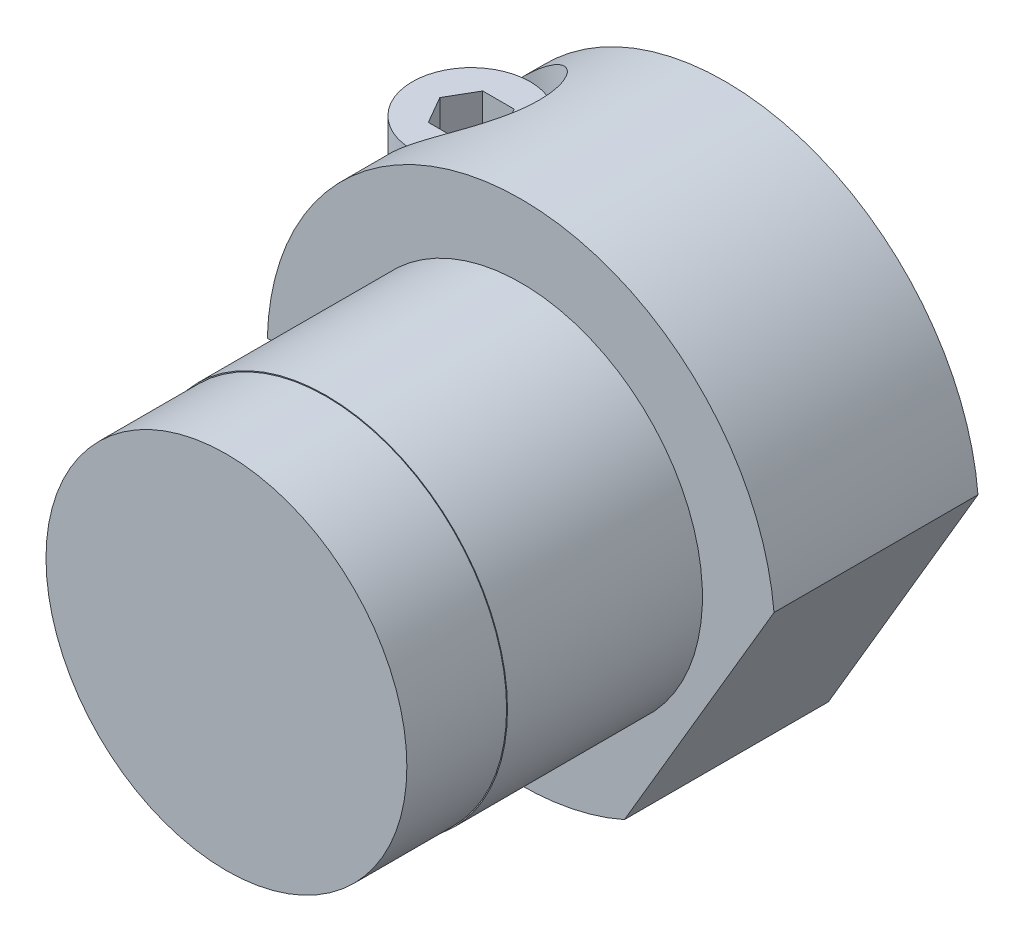
ISO-10303-21;
HEADER;
FILE_DESCRIPTION(('STEP AP214'),'2;1');
FILE_NAME('part.step','',(''),(''),'','','');
FILE_SCHEMA(('AUTOMOTIVE_DESIGN { 1 0 10303 214 1 1 1 1 }'));
ENDSEC;
DATA;
#1=APPLICATION_CONTEXT('core data for automotive mechanical design processes');
#2=APPLICATION_PROTOCOL_DEFINITION('international standard','automotive_design',2000,#1);
#3=PRODUCT_CONTEXT('',#1,'mechanical');
#4=PRODUCT('Part','Part','',(#3));
#5=PRODUCT_RELATED_PRODUCT_CATEGORY('part','',(#4));
#6=PRODUCT_DEFINITION_FORMATION('','',#4);
#7=PRODUCT_DEFINITION_CONTEXT('part definition',#1,'design');
#8=PRODUCT_DEFINITION('design','',#6,#7);
#9=PRODUCT_DEFINITION_SHAPE('','',#8);
#10=(LENGTH_UNIT() NAMED_UNIT(*) SI_UNIT(.MILLI.,.METRE.));
#11=(NAMED_UNIT(*) PLANE_ANGLE_UNIT() SI_UNIT($,.RADIAN.));
#12=(NAMED_UNIT(*) SI_UNIT($,.STERADIAN.) SOLID_ANGLE_UNIT());
#13=UNCERTAINTY_MEASURE_WITH_UNIT(LENGTH_MEASURE(1.E-05),#10,'distance_accuracy_value','');
#14=(GEOMETRIC_REPRESENTATION_CONTEXT(3) GLOBAL_UNCERTAINTY_ASSIGNED_CONTEXT((#13)) GLOBAL_UNIT_ASSIGNED_CONTEXT((#10,
#11,#12)) REPRESENTATION_CONTEXT('',''));
#15=CARTESIAN_POINT('',(0.,0.,0.));
#16=DIRECTION('',(0.,0.,1.));
#17=DIRECTION('',(1.,0.,0.));
#18=AXIS2_PLACEMENT_3D('',#15,#16,#17);
#19=CARTESIAN_POINT('',(-18.,10.7117113166242,10.));
#20=DIRECTION('',(0.,-1.,0.));
#21=DIRECTION('',(0.,0.,-1.));
#22=AXIS2_PLACEMENT_3D('',#19,#20,#21);
#23=PLANE('',#22);
#24=DIRECTION('',(-0.5,0.,0.866025403784439));
#25=VECTOR('',#24,1.);
#26=CARTESIAN_POINT('',(-16.2679491924311,10.7117113166242,13.));
#27=LINE('',#26,#25);
#28=CARTESIAN_POINT('',(-14.5358983848622,10.7117113166242,10.));
#29=VERTEX_POINT('',#28);
#30=CARTESIAN_POINT('',(-16.2679491924311,10.7117113166242,13.));
#31=VERTEX_POINT('',#30);
#32=EDGE_CURVE('E181',#29,#31,#27,.T.);
#33=ORIENTED_EDGE('',*,*,#32,.F.);
#34=DIRECTION('',(0.5,0.,0.866025403784438));
#35=VECTOR('',#34,1.);
#36=CARTESIAN_POINT('',(-14.5358983848622,10.7117113166242,10.));
#37=LINE('',#36,#35);
#38=CARTESIAN_POINT('',(-16.2679491924311,10.7117113166242,7.));
#39=VERTEX_POINT('',#38);
#40=EDGE_CURVE('E184',#39,#29,#37,.T.);
#41=ORIENTED_EDGE('',*,*,#40,.F.);
#42=DIRECTION('',(1.,0.,0.));
#43=VECTOR('',#42,1.);
#44=CARTESIAN_POINT('',(-16.2679491924311,10.7117113166242,7.));
#45=LINE('',#44,#43);
#46=CARTESIAN_POINT('',(-19.7320508075689,10.7117113166242,7.));
#47=VERTEX_POINT('',#46);
#48=EDGE_CURVE('E157',#47,#39,#45,.T.);
#49=ORIENTED_EDGE('',*,*,#48,.F.);
#50=DIRECTION('',(0.500000000000001,0.,-0.866025403784438));
#51=VECTOR('',#50,1.);
#52=CARTESIAN_POINT('',(-19.7320508075689,10.7117113166242,7.));
#53=LINE('',#52,#51);
#54=CARTESIAN_POINT('',(-21.4641016151378,10.7117113166242,10.));
#55=VERTEX_POINT('',#54);
#56=EDGE_CURVE('E163',#55,#47,#53,.T.);
#57=ORIENTED_EDGE('',*,*,#56,.F.);
#58=DIRECTION('',(-0.500000000000001,0.,-0.866025403784438));
#59=VECTOR('',#58,1.);
#60=CARTESIAN_POINT('',(-21.4641016151378,10.7117113166242,10.));
#61=LINE('',#60,#59);
#62=CARTESIAN_POINT('',(-19.7320508075689,10.7117113166242,13.));
#63=VERTEX_POINT('',#62);
#64=EDGE_CURVE('E169',#63,#55,#61,.T.);
#65=ORIENTED_EDGE('',*,*,#64,.F.);
#66=DIRECTION('',(-1.,0.,0.));
#67=VECTOR('',#66,1.);
#68=CARTESIAN_POINT('',(-19.7320508075689,10.7117113166242,13.));
#69=LINE('',#68,#67);
#70=EDGE_CURVE('E175',#31,#63,#69,.T.);
#71=ORIENTED_EDGE('',*,*,#70,.F.);
#72=EDGE_LOOP('',(#33,#41,#49,#57,#65,#71));
#73=FACE_BOUND('',#72,.T.);
#74=ADVANCED_FACE('F17',(#73),#23,.F.);
#75=CARTESIAN_POINT('',(0.,0.,55.));
#76=DIRECTION('',(0.,0.,1.));
#77=DIRECTION('',(1.,0.,0.));
#78=AXIS2_PLACEMENT_3D('',#75,#76,#77);
#79=PLANE('',#78);
#80=CARTESIAN_POINT('',(0.,0.,55.));
#81=DIRECTION('',(0.,0.,-1.));
#82=DIRECTION('',(-1.,0.,0.));
#83=AXIS2_PLACEMENT_3D('',#80,#81,#82);
#84=CIRCLE('',#83,19.9);
#85=CARTESIAN_POINT('',(-19.9,0.,55.));
#86=VERTEX_POINT('',#85);
#87=EDGE_CURVE('E20',#86,#86,#84,.T.);
#88=ORIENTED_EDGE('',*,*,#87,.F.);
#89=EDGE_LOOP('',(#88));
#90=FACE_BOUND('',#89,.T.);
#91=ADVANCED_FACE('F330',(#90),#79,.T.);
#92=CARTESIAN_POINT('',(-14.5358983848622,20.7117113166242,10.));
#93=DIRECTION('',(-0.866025403784438,0.,0.5));
#94=DIRECTION('',(0.5,0.,0.866025403784438));
#95=AXIS2_PLACEMENT_3D('',#92,#93,#94);
#96=PLANE('',#95);
#97=DIRECTION('',(0.500000000000001,0.,0.866025403784438));
#98=VECTOR('',#97,1.);
#99=CARTESIAN_POINT('',(-16.2679491924311,20.7117113166242,7.));
#100=LINE('',#99,#98);
#101=CARTESIAN_POINT('',(-16.2679491924311,20.7117113166242,7.));
#102=VERTEX_POINT('',#101);
#103=CARTESIAN_POINT('',(-14.5358983848622,20.7117113166242,10.));
#104=VERTEX_POINT('',#103);
#105=EDGE_CURVE('E148',#102,#104,#100,.T.);
#106=ORIENTED_EDGE('',*,*,#105,.F.);
#107=DIRECTION('',(0.,1.,0.));
#108=VECTOR('',#107,1.);
#109=CARTESIAN_POINT('',(-16.2679491924311,20.7117113166242,7.));
#110=LINE('',#109,#108);
#111=EDGE_CURVE('E154',#39,#102,#110,.T.);
#112=ORIENTED_EDGE('',*,*,#111,.F.);
#113=ORIENTED_EDGE('',*,*,#40,.T.);
#114=DIRECTION('',(0.,1.,0.));
#115=VECTOR('',#114,1.);
#116=CARTESIAN_POINT('',(-14.5358983848622,20.7117113166242,10.));
#117=LINE('',#116,#115);
#118=EDGE_CURVE('E178',#104,#29,#117,.F.);
#119=ORIENTED_EDGE('',*,*,#118,.F.);
#120=EDGE_LOOP('',(#106,#112,#113,#119));
#121=FACE_BOUND('',#120,.T.);
#122=ADVANCED_FACE('F332',(#121),#96,.T.);
#123=CARTESIAN_POINT('',(-16.2679491924311,20.7117113166242,13.));
#124=DIRECTION('',(-0.866025403784439,0.,-0.5));
#125=DIRECTION('',(-0.5,0.,0.866025403784439));
#126=AXIS2_PLACEMENT_3D('',#123,#124,#125);
#127=PLANE('',#126);
#128=DIRECTION('',(-0.500000000000001,0.,0.866025403784438));
#129=VECTOR('',#128,1.);
#130=CARTESIAN_POINT('',(-14.5358983848622,20.7117113166242,10.));
#131=LINE('',#130,#129);
#132=CARTESIAN_POINT('',(-16.2679491924311,20.7117113166242,13.));
#133=VERTEX_POINT('',#132);
#134=EDGE_CURVE('E145',#104,#133,#131,.T.);
#135=ORIENTED_EDGE('',*,*,#134,.F.);
#136=ORIENTED_EDGE('',*,*,#118,.T.);
#137=ORIENTED_EDGE('',*,*,#32,.T.);
#138=DIRECTION('',(0.,1.,0.));
#139=VECTOR('',#138,1.);
#140=CARTESIAN_POINT('',(-16.2679491924311,20.7117113166242,13.));
#141=LINE('',#140,#139);
#142=EDGE_CURVE('E172',#133,#31,#141,.F.);
#143=ORIENTED_EDGE('',*,*,#142,.F.);
#144=EDGE_LOOP('',(#135,#136,#137,#143));
#145=FACE_BOUND('',#144,.T.);
#146=ADVANCED_FACE('F337',(#145),#127,.T.);
#147=CARTESIAN_POINT('',(-19.7320508075689,20.7117113166242,13.));
#148=DIRECTION('',(0.,0.,-1.));
#149=DIRECTION('',(-1.,0.,0.));
#150=AXIS2_PLACEMENT_3D('',#147,#148,#149);
#151=PLANE('',#150);
#152=DIRECTION('',(1.,0.,0.));
#153=VECTOR('',#152,1.);
#154=CARTESIAN_POINT('',(-18.,20.7117113166242,13.));
#155=LINE('',#154,#153);
#156=CARTESIAN_POINT('',(-19.7320508075689,20.7117113166242,13.));
#157=VERTEX_POINT('',#156);
#158=EDGE_CURVE('E142',#133,#157,#155,.F.);
#159=ORIENTED_EDGE('',*,*,#158,.F.);
#160=ORIENTED_EDGE('',*,*,#142,.T.);
#161=ORIENTED_EDGE('',*,*,#70,.T.);
#162=DIRECTION('',(0.,1.,0.));
#163=VECTOR('',#162,1.);
#164=CARTESIAN_POINT('',(-19.7320508075689,20.7117113166242,13.));
#165=LINE('',#164,#163);
#166=EDGE_CURVE('E166',#157,#63,#165,.F.);
#167=ORIENTED_EDGE('',*,*,#166,.F.);
#168=EDGE_LOOP('',(#159,#160,#161,#167));
#169=FACE_BOUND('',#168,.T.);
#170=ADVANCED_FACE('F344',(#169),#151,.T.);
#171=CARTESIAN_POINT('',(-21.4641016151378,20.7117113166242,10.));
#172=DIRECTION('',(0.866025403784438,0.,-0.500000000000001));
#173=DIRECTION('',(-0.500000000000001,0.,-0.866025403784438));
#174=AXIS2_PLACEMENT_3D('',#171,#172,#173);
#175=PLANE('',#174);
#176=DIRECTION('',(-0.5,0.,-0.866025403784438));
#177=VECTOR('',#176,1.);
#178=CARTESIAN_POINT('',(-19.7320508075689,20.7117113166242,13.));
#179=LINE('',#178,#177);
#180=CARTESIAN_POINT('',(-21.4641016151378,20.7117113166242,10.));
#181=VERTEX_POINT('',#180);
#182=EDGE_CURVE('E139',#157,#181,#179,.T.);
#183=ORIENTED_EDGE('',*,*,#182,.F.);
#184=ORIENTED_EDGE('',*,*,#166,.T.);
#185=ORIENTED_EDGE('',*,*,#64,.T.);
#186=DIRECTION('',(0.,1.,0.));
#187=VECTOR('',#186,1.);
#188=CARTESIAN_POINT('',(-21.4641016151378,20.7117113166242,10.));
#189=LINE('',#188,#187);
#190=EDGE_CURVE('E160',#181,#55,#189,.F.);
#191=ORIENTED_EDGE('',*,*,#190,.F.);
#192=EDGE_LOOP('',(#183,#184,#185,#191));
#193=FACE_BOUND('',#192,.T.);
#194=ADVANCED_FACE('F348',(#193),#175,.T.);
#195=CARTESIAN_POINT('',(-19.7320508075689,20.7117113166242,7.));
#196=DIRECTION('',(0.866025403784438,0.,0.500000000000001));
#197=DIRECTION('',(0.500000000000001,0.,-0.866025403784438));
#198=AXIS2_PLACEMENT_3D('',#195,#196,#197);
#199=PLANE('',#198);
#200=DIRECTION('',(0.500000000000001,0.,-0.866025403784438));
#201=VECTOR('',#200,1.);
#202=CARTESIAN_POINT('',(-21.4641016151378,20.7117113166242,10.));
#203=LINE('',#202,#201);
#204=CARTESIAN_POINT('',(-19.7320508075689,20.7117113166242,7.));
#205=VERTEX_POINT('',#204);
#206=EDGE_CURVE('E136',#181,#205,#203,.T.);
#207=ORIENTED_EDGE('',*,*,#206,.F.);
#208=ORIENTED_EDGE('',*,*,#190,.T.);
#209=ORIENTED_EDGE('',*,*,#56,.T.);
#210=DIRECTION('',(0.,1.,0.));
#211=VECTOR('',#210,1.);
#212=CARTESIAN_POINT('',(-19.7320508075689,20.7117113166242,7.));
#213=LINE('',#212,#211);
#214=EDGE_CURVE('E151',#205,#47,#213,.F.);
#215=ORIENTED_EDGE('',*,*,#214,.F.);
#216=EDGE_LOOP('',(#207,#208,#209,#215));
#217=FACE_BOUND('',#216,.T.);
#218=ADVANCED_FACE('F352',(#217),#199,.T.);
#219=CARTESIAN_POINT('',(-16.2679491924311,20.7117113166242,7.));
#220=DIRECTION('',(0.,0.,1.));
#221=DIRECTION('',(1.,0.,0.));
#222=AXIS2_PLACEMENT_3D('',#219,#220,#221);
#223=PLANE('',#222);
#224=DIRECTION('',(1.,0.,0.));
#225=VECTOR('',#224,1.);
#226=CARTESIAN_POINT('',(-18.,20.7117113166242,7.));
#227=LINE('',#226,#225);
#228=EDGE_CURVE('E132',#205,#102,#227,.T.);
#229=ORIENTED_EDGE('',*,*,#228,.F.);
#230=ORIENTED_EDGE('',*,*,#214,.T.);
#231=ORIENTED_EDGE('',*,*,#48,.T.);
#232=ORIENTED_EDGE('',*,*,#111,.T.);
#233=EDGE_LOOP('',(#229,#230,#231,#232));
#234=FACE_BOUND('',#233,.T.);
#235=ADVANCED_FACE('F325',(#234),#223,.T.);
#236=CARTESIAN_POINT('',(0.,0.,55.));
#237=DIRECTION('',(0.,0.,-1.));
#238=DIRECTION('',(-1.,0.,0.));
#239=AXIS2_PLACEMENT_3D('',#236,#237,#238);
#240=CYLINDRICAL_SURFACE('',#239,19.9);
#241=CARTESIAN_POINT('',(0.,0.,44.));
#242=DIRECTION('',(0.,0.,-1.));
#243=DIRECTION('',(-1.,0.,0.));
#244=AXIS2_PLACEMENT_3D('',#241,#242,#243);
#245=CIRCLE('',#244,19.9);
#246=CARTESIAN_POINT('',(-19.9,0.,44.));
#247=VERTEX_POINT('',#246);
#248=EDGE_CURVE('E135',#247,#247,#245,.T.);
#249=ORIENTED_EDGE('',*,*,#248,.F.);
#250=EDGE_LOOP('',(#249));
#251=FACE_BOUND('',#250,.T.);
#252=ORIENTED_EDGE('',*,*,#87,.T.);
#253=EDGE_LOOP('',(#252));
#254=FACE_BOUND('',#253,.T.);
#255=ADVANCED_FACE('F321',(#251,#254),#240,.T.);
#256=CARTESIAN_POINT('',(-18.,20.7117113166242,10.));
#257=DIRECTION('',(0.,1.,0.));
#258=DIRECTION('',(0.,0.,1.));
#259=AXIS2_PLACEMENT_3D('',#256,#257,#258);
#260=PLANE('',#259);
#261=ORIENTED_EDGE('',*,*,#206,.T.);
#262=ORIENTED_EDGE('',*,*,#228,.T.);
#263=ORIENTED_EDGE('',*,*,#105,.T.);
#264=ORIENTED_EDGE('',*,*,#134,.T.);
#265=ORIENTED_EDGE('',*,*,#158,.T.);
#266=ORIENTED_EDGE('',*,*,#182,.T.);
#267=EDGE_LOOP('',(#261,#262,#263,#264,#265,#266));
#268=FACE_BOUND('',#267,.T.);
#269=CARTESIAN_POINT('',(-18.,20.7117113166242,10.));
#270=DIRECTION('',(0.,-1.,0.));
#271=DIRECTION('',(0.,0.,-1.));
#272=AXIS2_PLACEMENT_3D('',#269,#270,#271);
#273=CIRCLE('',#272,6.5);
#274=CARTESIAN_POINT('',(-18.,20.7117113166242,3.5));
#275=VERTEX_POINT('',#274);
#276=EDGE_CURVE('E131',#275,#275,#273,.T.);
#277=ORIENTED_EDGE('',*,*,#276,.F.);
#278=EDGE_LOOP('',(#277));
#279=FACE_BOUND('',#278,.T.);
#280=ADVANCED_FACE('F324',(#268,#279),#260,.T.);
#281=CARTESIAN_POINT('',(0.,0.,44.));
#282=DIRECTION('',(0.,0.,1.));
#283=DIRECTION('',(1.,0.,0.));
#284=AXIS2_PLACEMENT_3D('',#281,#282,#283);
#285=PLANE('',#284);
#286=CARTESIAN_POINT('',(0.,0.,44.));
#287=DIRECTION('',(0.,0.,-1.));
#288=DIRECTION('',(-1.,0.,0.));
#289=AXIS2_PLACEMENT_3D('',#286,#287,#288);
#290=CIRCLE('',#289,20.);
#291=CARTESIAN_POINT('',(-20.,0.,44.));
#292=VERTEX_POINT('',#291);
#293=EDGE_CURVE('E101',#292,#292,#290,.T.);
#294=ORIENTED_EDGE('',*,*,#293,.F.);
#295=EDGE_LOOP('',(#294));
#296=FACE_BOUND('',#295,.T.);
#297=ORIENTED_EDGE('',*,*,#248,.T.);
#298=EDGE_LOOP('',(#297));
#299=FACE_BOUND('',#298,.T.);
#300=ADVANCED_FACE('F319',(#296,#299),#285,.T.);
#301=CARTESIAN_POINT('',(-18.,20.7117113166242,10.));
#302=DIRECTION('',(0.,-1.,0.));
#303=DIRECTION('',(0.,0.,-1.));
#304=AXIS2_PLACEMENT_3D('',#301,#302,#303);
#305=CYLINDRICAL_SURFACE('',#304,6.5);
#306=ORIENTED_EDGE('',*,*,#276,.T.);
#307=EDGE_LOOP('',(#306));
#308=FACE_BOUND('',#307,.T.);
#309=CARTESIAN_POINT('',(-18.,10.7117113166242,10.));
#310=DIRECTION('',(0.,-1.,0.));
#311=DIRECTION('',(0.,0.,-1.));
#312=AXIS2_PLACEMENT_3D('',#309,#310,#311);
#313=CIRCLE('',#312,6.5);
#314=CARTESIAN_POINT('',(-18.,10.7117113166242,3.5));
#315=VERTEX_POINT('',#314);
#316=EDGE_CURVE('E100',#315,#315,#313,.F.);
#317=ORIENTED_EDGE('',*,*,#316,.T.);
#318=EDGE_LOOP('',(#317));
#319=FACE_BOUND('',#318,.T.);
#320=ADVANCED_FACE('F365',(#308,#319),#305,.T.);
#321=CARTESIAN_POINT('',(0.,0.,44.));
#322=DIRECTION('',(0.,0.,1.));
#323=DIRECTION('',(1.,0.,0.));
#324=AXIS2_PLACEMENT_3D('',#321,#322,#323);
#325=PLANE('',#324);
#326=CARTESIAN_POINT('',(0.,0.,44.));
#327=DIRECTION('',(0.,0.,-1.));
#328=DIRECTION('',(-1.,0.,0.));
#329=AXIS2_PLACEMENT_3D('',#326,#327,#328);
#330=CIRCLE('',#329,11.);
#331=CARTESIAN_POINT('',(-11.,0.,44.));
#332=VERTEX_POINT('',#331);
#333=EDGE_CURVE('E111',#332,#332,#330,.T.);
#334=ORIENTED_EDGE('',*,*,#333,.T.);
#335=EDGE_LOOP('',(#334));
#336=FACE_BOUND('',#335,.T.);
#337=ADVANCED_FACE('F369',(#336),#325,.F.);
#338=CARTESIAN_POINT('',(0.,0.,44.));
#339=DIRECTION('',(0.,0.,-1.));
#340=DIRECTION('',(-1.,0.,0.));
#341=AXIS2_PLACEMENT_3D('',#338,#339,#340);
#342=CYLINDRICAL_SURFACE('',#341,20.);
#343=DIRECTION('',(0.,0.,-1.));
#344=VECTOR('',#343,1.);
#345=CARTESIAN_POINT('',(-19.9844589857134,-0.788288683375796,44.));
#346=LINE('',#345,#344);
#347=CARTESIAN_POINT('',(-19.9844589857134,-0.788288683375792,23.));
#348=VERTEX_POINT('',#347);
#349=CARTESIAN_POINT('',(-19.9844589857134,-0.788288683375792,22.5));
#350=VERTEX_POINT('',#349);
#351=EDGE_CURVE('E129',#348,#350,#346,.T.);
#352=ORIENTED_EDGE('',*,*,#351,.T.);
#353=CARTESIAN_POINT('',(0.,0.,22.5));
#354=DIRECTION('',(0.,0.,-1.));
#355=DIRECTION('',(-1.,0.,0.));
#356=AXIS2_PLACEMENT_3D('',#353,#354,#355);
#357=CIRCLE('',#356,20.);
#358=CARTESIAN_POINT('',(-19.9873326635094,0.711711316624211,22.5));
#359=VERTEX_POINT('',#358);
#360=EDGE_CURVE('E96',#350,#359,#357,.F.);
#361=ORIENTED_EDGE('',*,*,#360,.T.);
#362=DIRECTION('',(0.,0.,-1.));
#363=VECTOR('',#362,1.);
#364=CARTESIAN_POINT('',(-19.9873326635094,0.711711316624211,44.));
#365=LINE('',#364,#363);
#366=CARTESIAN_POINT('',(-19.9873326635094,0.711711316624211,23.));
#367=VERTEX_POINT('',#366);
#368=EDGE_CURVE('E89',#359,#367,#365,.F.);
#369=ORIENTED_EDGE('',*,*,#368,.T.);
#370=CARTESIAN_POINT('',(0.,0.,23.));
#371=DIRECTION('',(0.,0.,-1.));
#372=DIRECTION('',(-1.,0.,0.));
#373=AXIS2_PLACEMENT_3D('',#370,#371,#372);
#374=CIRCLE('',#373,20.);
#375=EDGE_CURVE('E94',#348,#367,#374,.T.);
#376=ORIENTED_EDGE('',*,*,#375,.F.);
#377=EDGE_LOOP('',(#352,#361,#369,#376));
#378=FACE_BOUND('',#377,.T.);
#379=ORIENTED_EDGE('',*,*,#293,.T.);
#380=EDGE_LOOP('',(#379));
#381=FACE_BOUND('',#380,.T.);
#382=ADVANCED_FACE('F92',(#378,#381),#342,.T.);
#383=CARTESIAN_POINT('',(-18.,10.7117113166242,10.));
#384=DIRECTION('',(0.,-1.,0.));
#385=DIRECTION('',(0.,0.,-1.));
#386=AXIS2_PLACEMENT_3D('',#383,#384,#385);
#387=PLANE('',#386);
#388=ORIENTED_EDGE('',*,*,#316,.F.);
#389=EDGE_LOOP('',(#388));
#390=FACE_BOUND('',#389,.T.);
#391=CARTESIAN_POINT('',(-18.,10.7117113166242,10.));
#392=DIRECTION('',(0.,-1.,0.));
#393=DIRECTION('',(0.,0.,-1.));
#394=AXIS2_PLACEMENT_3D('',#391,#392,#393);
#395=CIRCLE('',#394,7.5);
#396=CARTESIAN_POINT('',(-18.,10.7117113166242,2.5));
#397=VERTEX_POINT('',#396);
#398=EDGE_CURVE('E125',#397,#397,#395,.F.);
#399=ORIENTED_EDGE('',*,*,#398,.T.);
#400=EDGE_LOOP('',(#399));
#401=FACE_BOUND('',#400,.T.);
#402=ADVANCED_FACE('F376',(#390,#401),#387,.F.);
#403=CARTESIAN_POINT('',(-18.,-4.28828868337579,10.));
#404=DIRECTION('',(0.,1.,0.));
#405=DIRECTION('',(0.,0.,1.));
#406=AXIS2_PLACEMENT_3D('',#403,#404,#405);
#407=CYLINDRICAL_SURFACE('',#406,4.);
#408=CARTESIAN_POINT('',(-18.,-0.788288683375789,10.));
#409=DIRECTION('',(0.,1.,0.));
#410=DIRECTION('',(0.,0.,1.));
#411=AXIS2_PLACEMENT_3D('',#408,#409,#410);
#412=CIRCLE('',#411,4.);
#413=CARTESIAN_POINT('',(-18.,-0.788288683375789,14.));
#414=VERTEX_POINT('',#413);
#415=EDGE_CURVE('E242',#414,#414,#412,.T.);
#416=ORIENTED_EDGE('',*,*,#415,.T.);
#417=EDGE_LOOP('',(#416));
#418=FACE_BOUND('',#417,.T.);
#419=CARTESIAN_POINT('',(-18.,0.711711316624211,10.));
#420=DIRECTION('',(0.,1.,0.));
#421=DIRECTION('',(0.,0.,1.));
#422=AXIS2_PLACEMENT_3D('',#419,#420,#421);
#423=CIRCLE('',#422,4.);
#424=CARTESIAN_POINT('',(-18.,0.711711316624211,14.));
#425=VERTEX_POINT('',#424);
#426=EDGE_CURVE('E120',#425,#425,#423,.F.);
#427=ORIENTED_EDGE('',*,*,#426,.T.);
#428=EDGE_LOOP('',(#427));
#429=FACE_BOUND('',#428,.T.);
#430=ADVANCED_FACE('F379',(#418,#429),#407,.T.);
#431=CARTESIAN_POINT('',(0.,0.,44.));
#432=DIRECTION('',(0.,0.,-1.));
#433=DIRECTION('',(-1.,0.,0.));
#434=AXIS2_PLACEMENT_3D('',#431,#432,#433);
#435=CYLINDRICAL_SURFACE('',#434,11.);
#436=CARTESIAN_POINT('',(0.,0.,23.));
#437=DIRECTION('',(0.,0.,-1.));
#438=DIRECTION('',(-1.,0.,0.));
#439=AXIS2_PLACEMENT_3D('',#436,#437,#438);
#440=CIRCLE('',#439,11.);
#441=CARTESIAN_POINT('',(-10.9769516261023,0.711711316624211,23.));
#442=VERTEX_POINT('',#441);
#443=CARTESIAN_POINT('',(-10.9717182315106,-0.788288683375789,23.));
#444=VERTEX_POINT('',#443);
#445=EDGE_CURVE('E110',#442,#444,#440,.F.);
#446=ORIENTED_EDGE('',*,*,#445,.F.);
#447=DIRECTION('',(0.,0.,1.));
#448=VECTOR('',#447,1.);
#449=CARTESIAN_POINT('',(-10.9769516261023,0.711711316624211,23.));
#450=LINE('',#449,#448);
#451=CARTESIAN_POINT('',(-10.9769516261023,0.711711316624211,0.500000000000007));
#452=VERTEX_POINT('',#451);
#453=EDGE_CURVE('E119',#442,#452,#450,.F.);
#454=ORIENTED_EDGE('',*,*,#453,.T.);
#455=CARTESIAN_POINT('',(0.,0.,0.500000000000007));
#456=DIRECTION('',(0.,0.,-1.));
#457=DIRECTION('',(-1.,0.,0.));
#458=AXIS2_PLACEMENT_3D('',#455,#456,#457);
#459=CIRCLE('',#458,11.);
#460=CARTESIAN_POINT('',(-10.9717182315106,-0.788288683375789,0.500000000000006));
#461=VERTEX_POINT('',#460);
#462=EDGE_CURVE('E245',#452,#461,#459,.T.);
#463=ORIENTED_EDGE('',*,*,#462,.T.);
#464=DIRECTION('',(0.,0.,-1.));
#465=VECTOR('',#464,1.);
#466=CARTESIAN_POINT('',(-10.9717182315106,-0.788288683375789,23.));
#467=LINE('',#466,#465);
#468=EDGE_CURVE('E239',#461,#444,#467,.F.);
#469=ORIENTED_EDGE('',*,*,#468,.T.);
#470=EDGE_LOOP('',(#446,#454,#463,#469));
#471=FACE_BOUND('',#470,.T.);
#472=ORIENTED_EDGE('',*,*,#333,.F.);
#473=EDGE_LOOP('',(#472));
#474=FACE_BOUND('',#473,.T.);
#475=ADVANCED_FACE('F292',(#471,#474),#435,.F.);
#476=CARTESIAN_POINT('',(0.,0.,23.));
#477=DIRECTION('',(0.,0.,-1.));
#478=DIRECTION('',(-1.,0.,0.));
#479=AXIS2_PLACEMENT_3D('',#476,#477,#478);
#480=PLANE('',#479);
#481=ORIENTED_EDGE('',*,*,#445,.T.);
#482=DIRECTION('',(1.,0.,0.));
#483=VECTOR('',#482,1.);
#484=CARTESIAN_POINT('',(-5.73874161497658,-0.788288683375789,23.));
#485=LINE('',#484,#483);
#486=EDGE_CURVE('E109',#444,#348,#485,.F.);
#487=ORIENTED_EDGE('',*,*,#486,.T.);
#488=ORIENTED_EDGE('',*,*,#375,.T.);
#489=DIRECTION('',(1.,0.,0.));
#490=VECTOR('',#489,1.);
#491=CARTESIAN_POINT('',(-5.73874161497658,0.711711316624211,23.));
#492=LINE('',#491,#490);
#493=EDGE_CURVE('E107',#367,#442,#492,.T.);
#494=ORIENTED_EDGE('',*,*,#493,.T.);
#495=EDGE_LOOP('',(#481,#487,#488,#494));
#496=FACE_BOUND('',#495,.T.);
#497=ADVANCED_FACE('F106',(#496),#480,.T.);
#498=CARTESIAN_POINT('',(0.,0.,22.5));
#499=DIRECTION('',(0.,0.,-1.));
#500=DIRECTION('',(-1.,0.,0.));
#501=AXIS2_PLACEMENT_3D('',#498,#499,#500);
#502=PLANE('',#501);
#503=DIRECTION('',(-0.507263176557331,-0.861791198440183,0.));
#504=VECTOR('',#503,1.);
#505=CARTESIAN_POINT('',(35.7123530112608,15.7402835641483,22.5));
#506=LINE('',#505,#504);
#507=CARTESIAN_POINT('',(11.3919038963928,-25.5778131515451,22.5));
#508=VERTEX_POINT('',#507);
#509=CARTESIAN_POINT('',(27.8922019892878,2.45460143175395,22.5));
#510=VERTEX_POINT('',#509);
#511=EDGE_CURVE('E279',#508,#510,#506,.F.);
#512=ORIENTED_EDGE('',*,*,#511,.T.);
#513=CARTESIAN_POINT('',(0.,0.,22.5));
#514=DIRECTION('',(0.,0.,-1.));
#515=DIRECTION('',(-1.,0.,0.));
#516=AXIS2_PLACEMENT_3D('',#513,#514,#515);
#517=CIRCLE('',#516,28.);
#518=CARTESIAN_POINT('',(-27.9909533064129,0.711711316624211,22.5));
#519=VERTEX_POINT('',#518);
#520=EDGE_CURVE('E203',#519,#510,#517,.T.);
#521=ORIENTED_EDGE('',*,*,#520,.F.);
#522=DIRECTION('',(1.,0.,0.));
#523=VECTOR('',#522,1.);
#524=CARTESIAN_POINT('',(-5.73874161497658,0.711711316624211,22.5));
#525=LINE('',#524,#523);
#526=EDGE_CURVE('E122',#519,#359,#525,.T.);
#527=ORIENTED_EDGE('',*,*,#526,.T.);
#528=ORIENTED_EDGE('',*,*,#360,.F.);
#529=DIRECTION('',(1.,0.,0.));
#530=VECTOR('',#529,1.);
#531=CARTESIAN_POINT('',(-5.73874161497658,-0.788288683375789,22.5));
#532=LINE('',#531,#530);
#533=CARTESIAN_POINT('',(-27.9889013887945,-0.788288683375795,22.5));
#534=VERTEX_POINT('',#533);
#535=EDGE_CURVE('E240',#350,#534,#532,.F.);
#536=ORIENTED_EDGE('',*,*,#535,.T.);
#537=CARTESIAN_POINT('',(0.,0.,22.5));
#538=DIRECTION('',(0.,0.,-1.));
#539=DIRECTION('',(-1.,0.,0.));
#540=AXIS2_PLACEMENT_3D('',#537,#538,#539);
#541=CIRCLE('',#540,28.);
#542=EDGE_CURVE('E241',#508,#534,#541,.T.);
#543=ORIENTED_EDGE('',*,*,#542,.F.);
#544=EDGE_LOOP('',(#512,#521,#527,#528,#536,#543));
#545=FACE_BOUND('',#544,.T.);
#546=ADVANCED_FACE('F260',(#545),#502,.F.);
#547=CARTESIAN_POINT('',(-18.,35.7117113166242,10.));
#548=DIRECTION('',(0.,-1.,0.));
#549=DIRECTION('',(0.,0.,-1.));
#550=AXIS2_PLACEMENT_3D('',#547,#548,#549);
#551=CYLINDRICAL_SURFACE('',#550,7.5);
#552=CARTESIAN_POINT('',(-18.,21.4476105895272,2.5));
#553=CARTESIAN_POINT('',(-17.754888978814,21.6533225075025,2.50000037741525));
#554=CARTESIAN_POINT('',(-17.5062411145953,21.8548245348682,2.51201144985951));
#555=CARTESIAN_POINT('',(-17.0037646968742,22.2480041600201,2.56217475933116));
#556=CARTESIAN_POINT('',(-16.7499360761054,22.439681630132,2.60032733598611));
#557=CARTESIAN_POINT('',(-16.2401988363951,22.8112962466926,2.70475135053767));
#558=CARTESIAN_POINT('',(-15.9842952589392,22.9912556305821,2.77096762470518));
#559=CARTESIAN_POINT('',(-15.4732512286323,23.3382465153155,2.93336463410484));
#560=CARTESIAN_POINT('',(-15.218110492624,23.5052835967951,3.02953234328355));
#561=CARTESIAN_POINT('',(-14.787148231727,23.7778224407047,3.2202063624093));
#562=CARTESIAN_POINT('',(-14.6101104144311,23.8869515018416,3.30684984532404));
#563=CARTESIAN_POINT('',(-14.2600280537906,24.0975783473541,3.49598854506456));
#564=CARTESIAN_POINT('',(-14.0869825734127,24.1990779353206,3.59847999783936));
#565=CARTESIAN_POINT('',(-13.7466499168325,24.3940172782554,3.8193722635907));
#566=CARTESIAN_POINT('',(-13.5793614439109,24.4874588554607,3.93776946407202));
#567=CARTESIAN_POINT('',(-13.2523427002259,24.6659708592978,4.19031615367427));
#568=CARTESIAN_POINT('',(-13.0926127200752,24.7510409641946,4.32446624778104));
#569=CARTESIAN_POINT('',(-12.7818451396908,24.9129543574885,4.60876378842802));
#570=CARTESIAN_POINT('',(-12.630854936055,24.989754436706,4.75898778457038));
#571=CARTESIAN_POINT('',(-12.3403531284133,25.1344789021013,5.07411748582934));
#572=CARTESIAN_POINT('',(-12.2008416617445,25.2024031820903,5.23902336655811));
#573=CARTESIAN_POINT('',(-11.9351598100387,25.3293040219173,5.58243977165851));
#574=CARTESIAN_POINT('',(-11.808987834206,25.3882816490504,5.76094866942888));
#575=CARTESIAN_POINT('',(-11.5716821797898,25.4973181774348,6.13025914517015));
#576=CARTESIAN_POINT('',(-11.4605472443191,25.5473778242161,6.32105969375974));
#577=CARTESIAN_POINT('',(-11.2638401502659,25.6346728726879,6.69621280945954));
#578=CARTESIAN_POINT('',(-11.176882109282,25.6726471374694,6.87966868653551));
#579=CARTESIAN_POINT('',(-11.0177424669859,25.7413455097975,7.2541903834877));
#580=CARTESIAN_POINT('',(-10.9455602851752,25.7720699021766,7.44525590405176));
#581=CARTESIAN_POINT('',(-10.8168136491258,25.8263707791222,7.83351501717346));
#582=CARTESIAN_POINT('',(-10.76024558216,25.8499489172823,8.03070718040737));
#583=CARTESIAN_POINT('',(-10.6633491413039,25.8900703050532,8.42974352423334));
#584=CARTESIAN_POINT('',(-10.6230204875065,25.9066136759175,8.63158762457989));
#585=CARTESIAN_POINT('',(-10.5604279948046,25.9321894818778,9.02963528032867));
#586=CARTESIAN_POINT('',(-10.5374649372202,25.9415130469506,9.22571056846743));
#587=CARTESIAN_POINT('',(-10.5070711322456,25.953838398345,9.61925756071924));
#588=CARTESIAN_POINT('',(-10.4996400669734,25.9568403140471,9.81672923617043));
#589=CARTESIAN_POINT('',(-10.5003867162558,25.9565382612658,10.2116167755795));
#590=CARTESIAN_POINT('',(-10.508562797543,25.9532349526156,10.4090326432153));
#591=CARTESIAN_POINT('',(-10.5404361693113,25.9403064807346,10.8023996111324));
#592=CARTESIAN_POINT('',(-10.5641334898398,25.9306813052653,10.9983507085772));
#593=CARTESIAN_POINT('',(-10.6265041490946,25.9051834663802,11.3855096041074));
#594=CARTESIAN_POINT('',(-10.6650321157761,25.8893714234381,11.5767448417523));
#595=CARTESIAN_POINT('',(-10.7566799708617,25.8514272879049,11.9550424557985));
#596=CARTESIAN_POINT('',(-10.809799647003,25.829295287249,12.142104892858));
#597=CARTESIAN_POINT('',(-10.9300846686012,25.7786249376986,12.510754514832));
#598=CARTESIAN_POINT('',(-10.9972493611889,25.7500868865788,12.6923419537978));
#599=CARTESIAN_POINT('',(-11.144935742313,25.6865113567287,13.0488222394999));
#600=CARTESIAN_POINT('',(-11.2254575314379,25.6514738290525,13.2237150358085));
#601=CARTESIAN_POINT('',(-11.3996983134568,25.5745188255108,13.5669805105932));
#602=CARTESIAN_POINT('',(-11.4935142442958,25.5325504017799,13.7352925426211));
#603=CARTESIAN_POINT('',(-11.6928885150207,25.4418620723651,14.0628947950592));
#604=CARTESIAN_POINT('',(-11.7984468467756,25.3931421713563,14.2221850217164));
#605=CARTESIAN_POINT('',(-12.0202094524036,25.2889218365571,14.5308067892314));
#606=CARTESIAN_POINT('',(-12.1364132095931,25.2334217318054,14.6801388128108));
#607=CARTESIAN_POINT('',(-12.3782965326061,25.115649821322,14.9680790379008));
#608=CARTESIAN_POINT('',(-12.5039767288137,25.0533775649765,15.1066865247575));
#609=CARTESIAN_POINT('',(-12.7679741644562,24.919900513271,15.3770629025954));
#610=CARTESIAN_POINT('',(-12.9065755494388,24.848464259462,15.5084399540306));
#611=CARTESIAN_POINT('',(-13.191166686296,24.6985623939915,15.7585601422843));
#612=CARTESIAN_POINT('',(-13.337156580632,24.6200966467685,15.8773030353604));
#613=CARTESIAN_POINT('',(-13.6351372720051,24.4563270662188,16.1018672928018));
#614=CARTESIAN_POINT('',(-13.7871288328836,24.3710223610544,16.2076870053536));
#615=CARTESIAN_POINT('',(-14.0957762461815,24.1938168166738,16.4063040384159));
#616=CARTESIAN_POINT('',(-14.252433681907,24.1019137231044,16.4990968759601));
#617=CARTESIAN_POINT('',(-14.5825553542208,23.9037489862632,16.6790233700423));
#618=CARTESIAN_POINT('',(-14.7563148700912,23.7969310542075,16.7650024126166));
#619=CARTESIAN_POINT('',(-15.1062686904023,23.5763325351612,16.9219300216893));
#620=CARTESIAN_POINT('',(-15.2824639539774,23.4625491411819,16.9928724765651));
#621=CARTESIAN_POINT('',(-15.6357628425403,23.2285983257194,17.1200854386416));
#622=CARTESIAN_POINT('',(-15.8128660001797,23.1084339389093,17.1763628463386));
#623=CARTESIAN_POINT('',(-16.1668726435819,22.8621688012245,17.2748481283029));
#624=CARTESIAN_POINT('',(-16.3437760839656,22.7360669037166,17.3170532721561));
#625=CARTESIAN_POINT('',(-16.7709060920881,22.4239406398007,17.4030254061782));
#626=CARTESIAN_POINT('',(-17.0205027897084,22.2351276986729,17.4399047340151));
#627=CARTESIAN_POINT('',(-17.5145417679325,21.8480969718634,17.4883873841303));
#628=CARTESIAN_POINT('',(-17.7589859261318,21.6498827007171,17.5000000770103));
#629=CARTESIAN_POINT('',(-18.2426151730793,21.2439947488511,17.4999999224781));
#630=CARTESIAN_POINT('',(-18.4817545371354,21.0362669751504,17.4882322711961));
#631=CARTESIAN_POINT('',(-18.9517882545176,20.6138215494211,17.4431090980555));
#632=CARTESIAN_POINT('',(-19.1826792740109,20.3991011366463,17.4097449491567));
#633=CARTESIAN_POINT('',(-19.635602600078,19.9635176185458,17.3231192498904));
#634=CARTESIAN_POINT('',(-19.8576160416987,19.7426429659227,17.2698175859469));
#635=CARTESIAN_POINT('',(-20.291592163728,19.2963257765379,17.1448995901868));
#636=CARTESIAN_POINT('',(-20.5035554981383,19.0708835383743,17.0732844520478));
#637=CARTESIAN_POINT('',(-20.9508030102684,18.5793312390062,16.8999503454165));
#638=CARTESIAN_POINT('',(-21.184236806805,18.3125964704209,16.7952242590049));
#639=CARTESIAN_POINT('',(-21.636486731429,17.775983934948,16.5643315129581));
#640=CARTESIAN_POINT('',(-21.8553000069912,17.5061055667226,16.4381606862815));
#641=CARTESIAN_POINT('',(-22.2780136971857,16.964905754302,16.165378824376));
#642=CARTESIAN_POINT('',(-22.4819106646209,16.6935839919784,16.0187630868844));
#643=CARTESIAN_POINT('',(-22.8744365887018,16.1515338169574,15.7055179609592));
#644=CARTESIAN_POINT('',(-23.0630690255754,15.8808052827799,15.5388931561231));
#645=CARTESIAN_POINT('',(-23.381517352646,15.406674247377,15.2274564168604));
#646=CARTESIAN_POINT('',(-23.5146175730505,15.2026410508267,15.0869452011681));
#647=CARTESIAN_POINT('',(-23.7715600559465,14.7976490349752,14.7934492510709));
#648=CARTESIAN_POINT('',(-23.8954011300323,14.5966906129429,14.6404629207431));
#649=CARTESIAN_POINT('',(-24.1331969458259,14.2000759951784,14.3212795643301));
#650=CARTESIAN_POINT('',(-24.2471674913995,14.0044116818361,14.1551045044297));
#651=CARTESIAN_POINT('',(-24.4647089639693,13.6208139687704,13.807821903941));
#652=CARTESIAN_POINT('',(-24.5682853795638,13.432876520173,13.6267223372031));
#653=CARTESIAN_POINT('',(-24.7706486106529,13.0561737093857,13.2342590084636));
#654=CARTESIAN_POINT('',(-24.8686235331788,12.8682305953732,13.0216725488205));
#655=CARTESIAN_POINT('',(-25.0489633955466,12.5135446675691,12.5730369267483));
#656=CARTESIAN_POINT('',(-25.1313394324234,12.346786810608,12.3370046272989));
#657=CARTESIAN_POINT('',(-25.2578473814754,12.0853945907953,11.9003979694365));
#658=CARTESIAN_POINT('',(-25.3063905982333,11.983156376265,11.7057451276596));
#659=CARTESIAN_POINT('',(-25.3891305509516,11.8068443637936,11.301190058378));
#660=CARTESIAN_POINT('',(-25.4233592495572,11.7327078530892,11.0913230461772));
#661=CARTESIAN_POINT('',(-25.469060382198,11.6331163733899,10.7024730549438));
#662=CARTESIAN_POINT('',(-25.4837003047787,11.600921242165,10.525623443013));
#663=CARTESIAN_POINT('',(-25.500231078657,11.5645431524025,10.1684950152695));
#664=CARTESIAN_POINT('',(-25.5021324144894,11.560337157336,9.98821914205159));
#665=CARTESIAN_POINT('',(-25.4930028089249,11.5804533129194,9.62978661358155));
#666=CARTESIAN_POINT('',(-25.4819807946293,11.6047557707057,9.45162858121344));
#667=CARTESIAN_POINT('',(-25.4481099344976,11.6788405627781,9.10186145820015));
#668=CARTESIAN_POINT('',(-25.4252472745375,11.7286526576279,8.93026026886842));
#669=CARTESIAN_POINT('',(-25.3559270709939,11.877983383426,8.51560598571939));
#670=CARTESIAN_POINT('',(-25.3034064721083,11.9898900071863,8.27809521287981));
#671=CARTESIAN_POINT('',(-25.1814397781827,12.243976771393,7.82456834745496));
#672=CARTESIAN_POINT('',(-25.1119413042439,12.3862504230635,7.60862174466026));
#673=CARTESIAN_POINT('',(-24.9648575859467,12.6799485655673,7.21026173534951));
#674=CARTESIAN_POINT('',(-24.8881375743856,12.830102718828,7.02656806756719));
#675=CARTESIAN_POINT('',(-24.7248880062804,13.1419532797275,6.67378634075868));
#676=CARTESIAN_POINT('',(-24.6383498475707,13.3036597622845,6.50471132194861));
#677=CARTESIAN_POINT('',(-24.4564228201435,13.6352210054962,6.17907867271935));
#678=CARTESIAN_POINT('',(-24.3610151010781,13.8050927319703,6.02254908220343));
#679=CARTESIAN_POINT('',(-24.1621566558115,14.1502610075255,5.72092809164729));
#680=CARTESIAN_POINT('',(-24.0587033496543,14.3255592857863,5.57584039093387));
#681=CARTESIAN_POINT('',(-23.8574707738534,14.657899935584,5.31343664706765));
#682=CARTESIAN_POINT('',(-23.7605713580803,14.814519814113,5.19490481608397));
#683=CARTESIAN_POINT('',(-23.5611235490443,15.1297148751684,4.96541915117205));
#684=CARTESIAN_POINT('',(-23.4585744556604,15.288290298132,4.85446626027674));
#685=CARTESIAN_POINT('',(-23.1425462061205,15.7660468633826,4.53238121194329));
#686=CARTESIAN_POINT('',(-22.9207544442888,16.0871446604293,4.33211103790602));
#687=CARTESIAN_POINT('',(-22.4558188434544,16.7300245746915,3.95977752571514));
#688=CARTESIAN_POINT('',(-22.212678493681,17.051806571723,3.78770959129598));
#689=CARTESIAN_POINT('',(-21.7054838388088,17.6929055067245,3.47248250940854));
#690=CARTESIAN_POINT('',(-21.4414374022749,18.0122233229597,3.32931255674689));
#691=CARTESIAN_POINT('',(-20.9312040885745,18.6014714250903,3.09161421206386));
#692=CARTESIAN_POINT('',(-20.6876598137664,18.8720803953544,2.99308713204047));
#693=CARTESIAN_POINT('',(-20.1860115372316,19.4077183278368,2.82074610017297));
#694=CARTESIAN_POINT('',(-19.9279070305247,19.6727470960832,2.74693300607959));
#695=CARTESIAN_POINT('',(-19.3983401158388,20.1951132126563,2.62651305926532));
#696=CARTESIAN_POINT('',(-19.1268901324289,20.452457369447,2.57988140204012));
#697=CARTESIAN_POINT('',(-18.5719238733246,20.9576793438122,2.51662803371798));
#698=CARTESIAN_POINT('',(-18.2884103331285,21.2055592835326,2.49999955591365));
#699=CARTESIAN_POINT('',(-18.,21.4476105895272,2.5));
#700=B_SPLINE_CURVE_WITH_KNOTS('',3,(#552,#553,#554,#555,#556,#557,#558,#559,#560,#561,#562,
#563,#564,#565,#566,#567,#568,#569,#570,#571,#572,#573,#574,#575,#576,#577,#578,#579,#580,#581,
#582,#583,#584,#585,#586,#587,#588,#589,#590,#591,#592,#593,#594,#595,#596,#597,#598,#599,#600,
#601,#602,#603,#604,#605,#606,#607,#608,#609,#610,#611,#612,#613,#614,#615,#616,#617,#618,#619,
#620,#621,#622,#623,#624,#625,#626,#627,#628,#629,#630,#631,#632,#633,#634,#635,#636,#637,#638,
#639,#640,#641,#642,#643,#644,#645,#646,#647,#648,#649,#650,#651,#652,#653,#654,#655,#656,#657,
#658,#659,#660,#661,#662,#663,#664,#665,#666,#667,#668,#669,#670,#671,#672,#673,#674,#675,#676,
#677,#678,#679,#680,#681,#682,#683,#684,#685,#686,#687,#688,#689,#690,#691,#692,#693,#694,#695,
#696,#697,#698,#699),.UNSPECIFIED.,.T.,.F.,(4,2,2,2,2,2,2,2,2,2,2,2,2,2,2,2,2,2,2,2,2,2,2,2,2,2,
2,2,2,2,2,2,2,2,2,2,2,2,2,2,2,2,2,2,2,2,2,2,2,2,2,2,2,2,2,2,2,2,2,2,2,2,2,2,2,2,2,2,2,2,2,2,2,
4),(0.,0.959672632172328,1.91935773254295,2.8771651026476,3.83455649705842,4.50979665155055,
5.18487667541253,5.8598036342663,6.53475652199977,7.21308033315997,7.89141225894138,
8.56966319905736,9.2478574117653,9.86670782570279,10.4855339222234,11.1042167171567,
11.722888847839,12.3150851880012,12.9072694079877,13.4993916600701,14.091515058439,
14.6779763936888,15.2644291982468,15.8508547481638,16.4372847144879,17.0282347829673,
17.6191844422472,18.2101054345261,18.8010657703175,19.412085931993,20.0231178795394,
20.6342278463296,21.2455476028653,21.9089194747572,22.5725604593473,23.2358886078943,
23.8993453859221,24.8433782897499,25.7870610216921,26.7370128052849,27.6873442955454,
28.6395981946872,29.5917900414605,30.6996048283351,31.8076351272059,32.9159206910536,
34.0239528558392,34.8672377812539,35.7106307566068,36.5526473846415,37.394217021763,
38.293336519749,39.1918139618888,39.8653026402229,40.5372793624586,41.075937744565,
41.6141527276424,42.1519961452755,42.6904684668549,43.4891423159051,44.2903120024384,
45.0372779126748,45.7849034057999,46.5341558166133,47.2836494866946,47.9404788988278,
48.5973898906656,49.9116883989233,51.2257724956762,52.5393643316296,53.6698136795832,
54.8003022580875,55.9297575841104,57.0589581488175),.UNSPECIFIED.);
#701=CARTESIAN_POINT('',(-18.,21.4476105895272,2.5));
#702=VERTEX_POINT('',#701);
#703=EDGE_CURVE('E195',#702,#702,#700,.T.);
#704=ORIENTED_EDGE('',*,*,#703,.F.);
#705=EDGE_LOOP('',(#704));
#706=FACE_BOUND('',#705,.T.);
#707=ORIENTED_EDGE('',*,*,#398,.F.);
#708=EDGE_LOOP('',(#707));
#709=FACE_BOUND('',#708,.T.);
#710=ADVANCED_FACE('F205',(#706,#709),#551,.F.);
#711=CARTESIAN_POINT('',(-5.73874161497658,0.711711316624211,23.));
#712=DIRECTION('',(0.,1.,0.));
#713=DIRECTION('',(0.,0.,1.));
#714=AXIS2_PLACEMENT_3D('',#711,#712,#713);
#715=PLANE('',#714);
#716=DIRECTION('',(0.,0.,-1.));
#717=VECTOR('',#716,1.);
#718=CARTESIAN_POINT('',(-27.9909533064129,0.711711316624211,22.5));
#719=LINE('',#718,#717);
#720=CARTESIAN_POINT('',(-27.9909533064129,0.711711316624211,0.));
#721=VERTEX_POINT('',#720);
#722=EDGE_CURVE('E298',#721,#519,#719,.F.);
#723=ORIENTED_EDGE('',*,*,#722,.F.);
#724=DIRECTION('',(1.,0.,0.));
#725=VECTOR('',#724,1.);
#726=CARTESIAN_POINT('',(0.,0.711711316624211,0.));
#727=LINE('',#726,#725);
#728=CARTESIAN_POINT('',(-11.4779556978492,0.711711316624211,0.));
#729=VERTEX_POINT('',#728);
#730=EDGE_CURVE('E194',#721,#729,#727,.T.);
#731=ORIENTED_EDGE('',*,*,#730,.T.);
#732=CARTESIAN_POINT('',(-11.4779556978492,0.711711316624211,0.));
#733=CARTESIAN_POINT('',(-11.3944587417363,0.711711316624211,0.0833370633184337));
#734=CARTESIAN_POINT('',(-11.3109599243681,0.711711316624211,0.166672261643856));
#735=CARTESIAN_POINT('',(-11.1439585671191,0.711711316624211,0.333338928310525));
#736=CARTESIAN_POINT('',(-11.0604560272384,0.711711316624211,0.416670396651772));
#737=CARTESIAN_POINT('',(-10.9769516261023,0.711711316624211,0.500000000000008));
#738=B_SPLINE_CURVE_WITH_KNOTS('',3,(#732,#733,#734,#735,#736,#737),.UNSPECIFIED.,.F.,.F.,(4,2,
4),(0.,0.353908561688554,0.707817123384955),.UNSPECIFIED.);
#739=EDGE_CURVE('E246',#729,#452,#738,.T.);
#740=ORIENTED_EDGE('',*,*,#739,.T.);
#741=ORIENTED_EDGE('',*,*,#453,.F.);
#742=ORIENTED_EDGE('',*,*,#493,.F.);
#743=ORIENTED_EDGE('',*,*,#368,.F.);
#744=ORIENTED_EDGE('',*,*,#526,.F.);
#745=EDGE_LOOP('',(#723,#731,#740,#741,#742,#743,#744));
#746=FACE_BOUND('',#745,.T.);
#747=ORIENTED_EDGE('',*,*,#426,.F.);
#748=EDGE_LOOP('',(#747));
#749=FACE_BOUND('',#748,.T.);
#750=ADVANCED_FACE('F115',(#746,#749),#715,.F.);
#751=CARTESIAN_POINT('',(0.,0.,0.));
#752=DIRECTION('',(0.,0.,-1.));
#753=DIRECTION('',(-1.,0.,0.));
#754=AXIS2_PLACEMENT_3D('',#751,#752,#753);
#755=CONICAL_SURFACE('',#754,11.5,0.785398163397438);
#756=ORIENTED_EDGE('',*,*,#462,.F.);
#757=ORIENTED_EDGE('',*,*,#739,.F.);
#758=CARTESIAN_POINT('',(0.,0.,0.));
#759=DIRECTION('',(0.,0.,-1.));
#760=DIRECTION('',(-1.,0.,0.));
#761=AXIS2_PLACEMENT_3D('',#758,#759,#760);
#762=CIRCLE('',#761,11.5);
#763=CARTESIAN_POINT('',(-11.4729508388933,-0.788288683375789,0.));
#764=VERTEX_POINT('',#763);
#765=EDGE_CURVE('E191',#729,#764,#762,.T.);
#766=ORIENTED_EDGE('',*,*,#765,.T.);
#767=CARTESIAN_POINT('',(-11.4729508388933,-0.788288683375789,0.));
#768=CARTESIAN_POINT('',(-11.3894166418233,-0.788288683375789,0.0833379154258029));
#769=CARTESIAN_POINT('',(-11.3058801593405,-0.788288683375789,0.166673539804676));
#770=CARTESIAN_POINT('',(-11.1388026235463,-0.788288683375789,0.333340206471345));
#771=CARTESIAN_POINT('',(-11.0552615702349,-0.788288683375789,0.416671248759142));
#772=CARTESIAN_POINT('',(-10.9717182315106,-0.788288683375789,0.500000000000007));
#773=B_SPLINE_CURVE_WITH_KNOTS('',3,(#767,#768,#769,#770,#771,#772),.UNSPECIFIED.,.F.,.F.,(4,2,
4),(0.,0.353989451489691,0.707978902991214),.UNSPECIFIED.);
#774=EDGE_CURVE('E232',#764,#461,#773,.T.);
#775=ORIENTED_EDGE('',*,*,#774,.T.);
#776=EDGE_LOOP('',(#756,#757,#766,#775));
#777=FACE_BOUND('',#776,.T.);
#778=ADVANCED_FACE('F228',(#777),#755,.F.);
#779=CARTESIAN_POINT('',(-5.73874161497658,-0.788288683375789,23.));
#780=DIRECTION('',(0.,-1.,0.));
#781=DIRECTION('',(0.,0.,-1.));
#782=AXIS2_PLACEMENT_3D('',#779,#780,#781);
#783=PLANE('',#782);
#784=ORIENTED_EDGE('',*,*,#468,.F.);
#785=ORIENTED_EDGE('',*,*,#774,.F.);
#786=DIRECTION('',(1.,0.,0.));
#787=VECTOR('',#786,1.);
#788=CARTESIAN_POINT('',(0.,-0.788288683375789,0.));
#789=LINE('',#788,#787);
#790=CARTESIAN_POINT('',(-27.9889013887945,-0.788288683375795,0.));
#791=VERTEX_POINT('',#790);
#792=EDGE_CURVE('E190',#764,#791,#789,.F.);
#793=ORIENTED_EDGE('',*,*,#792,.T.);
#794=DIRECTION('',(0.,0.,-1.));
#795=VECTOR('',#794,1.);
#796=CARTESIAN_POINT('',(-27.9889013887945,-0.788288683375801,22.5));
#797=LINE('',#796,#795);
#798=EDGE_CURVE('E275',#534,#791,#797,.T.);
#799=ORIENTED_EDGE('',*,*,#798,.F.);
#800=ORIENTED_EDGE('',*,*,#535,.F.);
#801=ORIENTED_EDGE('',*,*,#351,.F.);
#802=ORIENTED_EDGE('',*,*,#486,.F.);
#803=EDGE_LOOP('',(#784,#785,#793,#799,#800,#801,#802));
#804=FACE_BOUND('',#803,.T.);
#805=ORIENTED_EDGE('',*,*,#415,.F.);
#806=EDGE_LOOP('',(#805));
#807=FACE_BOUND('',#806,.T.);
#808=ADVANCED_FACE('F223',(#804,#807),#783,.F.);
#809=CARTESIAN_POINT('',(0.,0.,22.5));
#810=DIRECTION('',(0.,0.,-1.));
#811=DIRECTION('',(-1.,0.,0.));
#812=AXIS2_PLACEMENT_3D('',#809,#810,#811);
#813=CYLINDRICAL_SURFACE('',#812,28.);
#814=ORIENTED_EDGE('',*,*,#798,.T.);
#815=CARTESIAN_POINT('',(0.,0.,0.));
#816=DIRECTION('',(0.,0.,-1.));
#817=DIRECTION('',(-1.,0.,0.));
#818=AXIS2_PLACEMENT_3D('',#815,#816,#817);
#819=CIRCLE('',#818,28.);
#820=CARTESIAN_POINT('',(11.3919038963928,-25.5778131515451,0.));
#821=VERTEX_POINT('',#820);
#822=EDGE_CURVE('E187',#791,#821,#819,.F.);
#823=ORIENTED_EDGE('',*,*,#822,.T.);
#824=DIRECTION('',(0.,0.,1.));
#825=VECTOR('',#824,1.);
#826=CARTESIAN_POINT('',(11.3919038963928,-25.5778131515451,25.));
#827=LINE('',#826,#825);
#828=EDGE_CURVE('E273',#821,#508,#827,.T.);
#829=ORIENTED_EDGE('',*,*,#828,.T.);
#830=ORIENTED_EDGE('',*,*,#542,.T.);
#831=EDGE_LOOP('',(#814,#823,#829,#830));
#832=FACE_BOUND('',#831,.T.);
#833=ADVANCED_FACE('F219',(#832),#813,.T.);
#834=CARTESIAN_POINT('',(35.7123530112608,15.7402835641483,25.));
#835=DIRECTION('',(-0.861791198440183,0.507263176557331,0.));
#836=DIRECTION('',(-0.507263176557331,-0.861791198440183,0.));
#837=AXIS2_PLACEMENT_3D('',#834,#835,#836);
#838=PLANE('',#837);
#839=ORIENTED_EDGE('',*,*,#511,.F.);
#840=ORIENTED_EDGE('',*,*,#828,.F.);
#841=DIRECTION('',(0.507263176557331,0.861791198440183,0.));
#842=VECTOR('',#841,1.);
#843=CARTESIAN_POINT('',(11.3919038963928,-25.5778131515451,0.));
#844=LINE('',#843,#842);
#845=CARTESIAN_POINT('',(27.8922019892878,2.45460143175395,0.));
#846=VERTEX_POINT('',#845);
#847=EDGE_CURVE('E26',#821,#846,#844,.T.);
#848=ORIENTED_EDGE('',*,*,#847,.T.);
#849=DIRECTION('',(0.,0.,-1.));
#850=VECTOR('',#849,1.);
#851=CARTESIAN_POINT('',(27.8922019892878,2.45460143175395,22.5));
#852=LINE('',#851,#850);
#853=EDGE_CURVE('E34',#510,#846,#852,.T.);
#854=ORIENTED_EDGE('',*,*,#853,.F.);
#855=EDGE_LOOP('',(#839,#840,#848,#854));
#856=FACE_BOUND('',#855,.T.);
#857=ADVANCED_FACE('F215',(#856),#838,.F.);
#858=CARTESIAN_POINT('',(0.,0.,22.5));
#859=DIRECTION('',(0.,0.,-1.));
#860=DIRECTION('',(-1.,0.,0.));
#861=AXIS2_PLACEMENT_3D('',#858,#859,#860);
#862=CYLINDRICAL_SURFACE('',#861,28.);
#863=ORIENTED_EDGE('',*,*,#703,.T.);
#864=EDGE_LOOP('',(#863));
#865=FACE_BOUND('',#864,.T.);
#866=ORIENTED_EDGE('',*,*,#722,.T.);
#867=ORIENTED_EDGE('',*,*,#520,.T.);
#868=ORIENTED_EDGE('',*,*,#853,.T.);
#869=CARTESIAN_POINT('',(0.,0.,0.));
#870=DIRECTION('',(0.,0.,-1.));
#871=DIRECTION('',(-1.,0.,0.));
#872=AXIS2_PLACEMENT_3D('',#869,#870,#871);
#873=CIRCLE('',#872,28.);
#874=EDGE_CURVE('E11',#846,#721,#873,.F.);
#875=ORIENTED_EDGE('',*,*,#874,.T.);
#876=EDGE_LOOP('',(#866,#867,#868,#875));
#877=FACE_BOUND('',#876,.T.);
#878=ADVANCED_FACE('F209',(#865,#877),#862,.T.);
#879=CARTESIAN_POINT('',(0.,0.,0.));
#880=DIRECTION('',(0.,0.,1.));
#881=DIRECTION('',(1.,0.,0.));
#882=AXIS2_PLACEMENT_3D('',#879,#880,#881);
#883=PLANE('',#882);
#884=ORIENTED_EDGE('',*,*,#847,.F.);
#885=ORIENTED_EDGE('',*,*,#822,.F.);
#886=ORIENTED_EDGE('',*,*,#792,.F.);
#887=ORIENTED_EDGE('',*,*,#765,.F.);
#888=ORIENTED_EDGE('',*,*,#730,.F.);
#889=ORIENTED_EDGE('',*,*,#874,.F.);
#890=EDGE_LOOP('',(#884,#885,#886,#887,#888,#889));
#891=FACE_BOUND('',#890,.T.);
#892=ADVANCED_FACE('F214',(#891),#883,.F.);
#893=CLOSED_SHELL('',(#74,#91,#122,#146,#170,#194,#218,#235,#255,#280,#300,#320,#337,#382,#402,
#430,#475,#497,#546,#710,#750,#778,#808,#833,#857,#878,#892));
#894=MANIFOLD_SOLID_BREP('B1',#893);
#895=ADVANCED_BREP_SHAPE_REPRESENTATION('',(#18,#894),#14);
#896=SHAPE_DEFINITION_REPRESENTATION(#9,#895);
ENDSEC;
END-ISO-10303-21;
